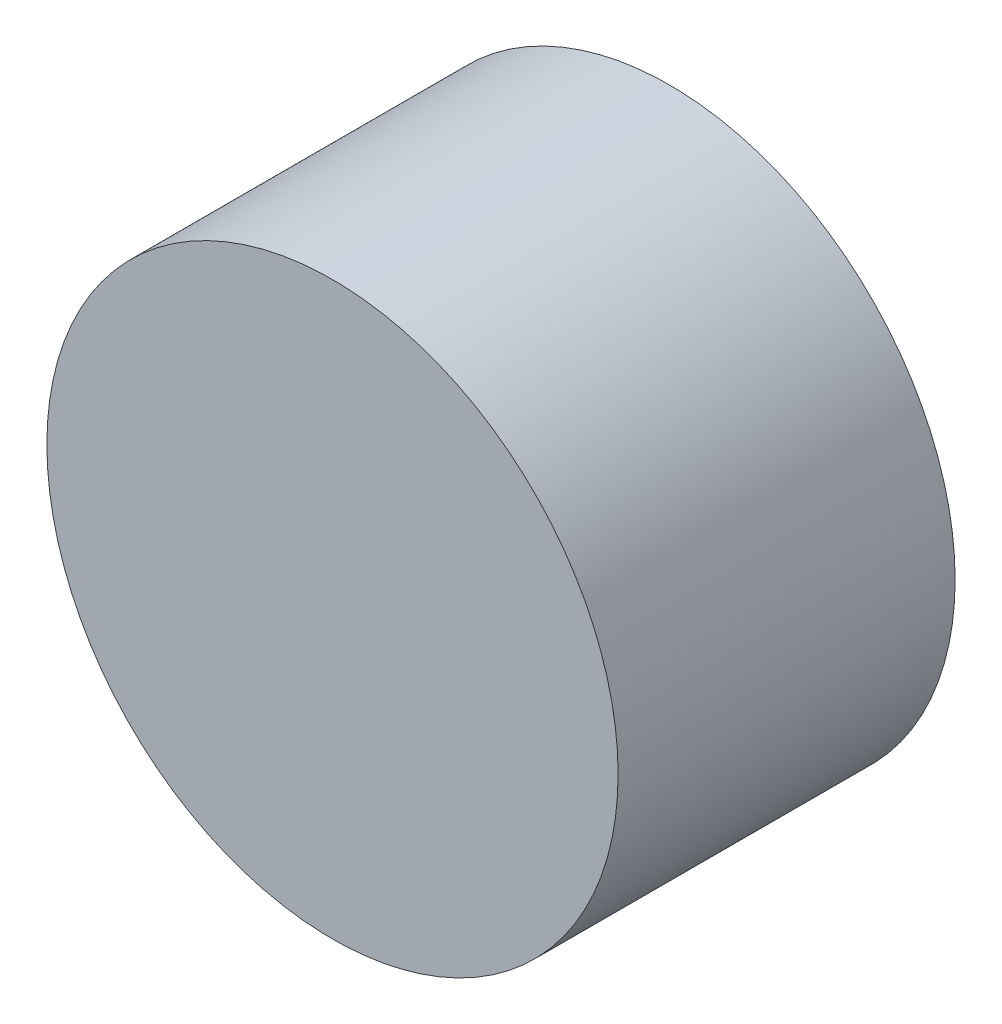
ISO-10303-21;
HEADER;
FILE_DESCRIPTION(('STEP AP214'),'2;1');
FILE_NAME('part.step','',(''),(''),'','','');
FILE_SCHEMA(('AUTOMOTIVE_DESIGN { 1 0 10303 214 1 1 1 1 }'));
ENDSEC;
DATA;
#1=APPLICATION_CONTEXT('core data for automotive mechanical design processes');
#2=APPLICATION_PROTOCOL_DEFINITION('international standard','automotive_design',2000,#1);
#3=PRODUCT_CONTEXT('',#1,'mechanical');
#4=PRODUCT('Part','Part','',(#3));
#5=PRODUCT_RELATED_PRODUCT_CATEGORY('part','',(#4));
#6=PRODUCT_DEFINITION_FORMATION('','',#4);
#7=PRODUCT_DEFINITION_CONTEXT('part definition',#1,'design');
#8=PRODUCT_DEFINITION('design','',#6,#7);
#9=PRODUCT_DEFINITION_SHAPE('','',#8);
#10=(LENGTH_UNIT() NAMED_UNIT(*) SI_UNIT(.MILLI.,.METRE.));
#11=(NAMED_UNIT(*) PLANE_ANGLE_UNIT() SI_UNIT($,.RADIAN.));
#12=(NAMED_UNIT(*) SI_UNIT($,.STERADIAN.) SOLID_ANGLE_UNIT());
#13=UNCERTAINTY_MEASURE_WITH_UNIT(LENGTH_MEASURE(1.E-05),#10,'distance_accuracy_value','');
#14=(GEOMETRIC_REPRESENTATION_CONTEXT(3) GLOBAL_UNCERTAINTY_ASSIGNED_CONTEXT((#13)) GLOBAL_UNIT_ASSIGNED_CONTEXT((#10,
#11,#12)) REPRESENTATION_CONTEXT('',''));
#15=CARTESIAN_POINT('',(0.,0.,0.));
#16=DIRECTION('',(0.,0.,1.));
#17=DIRECTION('',(1.,0.,0.));
#18=AXIS2_PLACEMENT_3D('',#15,#16,#17);
#19=CARTESIAN_POINT('',(0.100124667768713,0.191175985001809,20.));
#20=DIRECTION('',(0.,0.,-1.));
#21=DIRECTION('',(-1.,0.,0.));
#22=AXIS2_PLACEMENT_3D('',#19,#20,#21);
#23=CYLINDRICAL_SURFACE('',#22,16.95);
#24=CARTESIAN_POINT('',(0.100124667768713,0.191175985001809,20.));
#25=DIRECTION('',(0.,0.,1.));
#26=DIRECTION('',(1.,0.,0.));
#27=AXIS2_PLACEMENT_3D('',#24,#25,#26);
#28=CIRCLE('',#27,16.95);
#29=CARTESIAN_POINT('',(17.0501246677687,0.191175985001809,20.));
#30=VERTEX_POINT('',#29);
#31=EDGE_CURVE('E10',#30,#30,#28,.T.);
#32=ORIENTED_EDGE('',*,*,#31,.F.);
#33=EDGE_LOOP('',(#32));
#34=FACE_BOUND('',#33,.T.);
#35=CARTESIAN_POINT('',(0.100124667768713,0.191175985001809,0.));
#36=DIRECTION('',(0.,0.,1.));
#37=DIRECTION('',(1.,0.,0.));
#38=AXIS2_PLACEMENT_3D('',#35,#36,#37);
#39=CIRCLE('',#38,16.95);
#40=CARTESIAN_POINT('',(17.0501246677687,0.191175985001809,0.));
#41=VERTEX_POINT('',#40);
#42=EDGE_CURVE('E34',#41,#41,#39,.T.);
#43=ORIENTED_EDGE('',*,*,#42,.T.);
#44=EDGE_LOOP('',(#43));
#45=FACE_BOUND('',#44,.T.);
#46=ADVANCED_FACE('F31',(#34,#45),#23,.T.);
#47=CARTESIAN_POINT('',(0.100124667768713,0.191175985001809,20.));
#48=DIRECTION('',(0.,0.,1.));
#49=DIRECTION('',(1.,0.,0.));
#50=AXIS2_PLACEMENT_3D('',#47,#48,#49);
#51=PLANE('',#50);
#52=ORIENTED_EDGE('',*,*,#31,.T.);
#53=EDGE_LOOP('',(#52));
#54=FACE_BOUND('',#53,.T.);
#55=ADVANCED_FACE('F46',(#54),#51,.T.);
#56=CARTESIAN_POINT('',(0.100124667768713,0.191175985001809,0.));
#57=DIRECTION('',(0.,0.,1.));
#58=DIRECTION('',(1.,0.,0.));
#59=AXIS2_PLACEMENT_3D('',#56,#57,#58);
#60=PLANE('',#59);
#61=ORIENTED_EDGE('',*,*,#42,.F.);
#62=EDGE_LOOP('',(#61));
#63=FACE_BOUND('',#62,.T.);
#64=ADVANCED_FACE('F44',(#63),#60,.F.);
#65=CLOSED_SHELL('',(#46,#55,#64));
#66=MANIFOLD_SOLID_BREP('B2',#65);
#67=ADVANCED_BREP_SHAPE_REPRESENTATION('',(#18,#66),#14);
#68=SHAPE_DEFINITION_REPRESENTATION(#9,#67);
ENDSEC;
END-ISO-10303-21;
